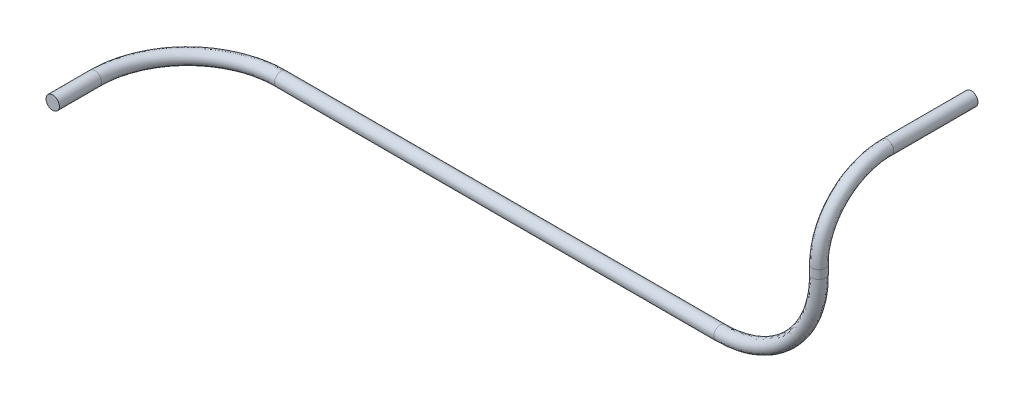
ISO-10303-21;
HEADER;
FILE_DESCRIPTION(('STEP AP214'),'2;1');
FILE_NAME('part.step','',(''),(''),'','','');
FILE_SCHEMA(('AUTOMOTIVE_DESIGN { 1 0 10303 214 1 1 1 1 }'));
ENDSEC;
DATA;
#1=APPLICATION_CONTEXT('core data for automotive mechanical design processes');
#2=APPLICATION_PROTOCOL_DEFINITION('international standard','automotive_design',2000,#1);
#3=PRODUCT_CONTEXT('',#1,'mechanical');
#4=PRODUCT('Part','Part','',(#3));
#5=PRODUCT_RELATED_PRODUCT_CATEGORY('part','',(#4));
#6=PRODUCT_DEFINITION_FORMATION('','',#4);
#7=PRODUCT_DEFINITION_CONTEXT('part definition',#1,'design');
#8=PRODUCT_DEFINITION('design','',#6,#7);
#9=PRODUCT_DEFINITION_SHAPE('','',#8);
#10=(LENGTH_UNIT() NAMED_UNIT(*) SI_UNIT(.MILLI.,.METRE.));
#11=(NAMED_UNIT(*) PLANE_ANGLE_UNIT() SI_UNIT($,.RADIAN.));
#12=(NAMED_UNIT(*) SI_UNIT($,.STERADIAN.) SOLID_ANGLE_UNIT());
#13=UNCERTAINTY_MEASURE_WITH_UNIT(LENGTH_MEASURE(1.E-05),#10,'distance_accuracy_value','');
#14=(GEOMETRIC_REPRESENTATION_CONTEXT(3) GLOBAL_UNCERTAINTY_ASSIGNED_CONTEXT((#13)) GLOBAL_UNIT_ASSIGNED_CONTEXT((#10,
#11,#12)) REPRESENTATION_CONTEXT('',''));
#15=CARTESIAN_POINT('',(0.,0.,0.));
#16=DIRECTION('',(0.,0.,1.));
#17=DIRECTION('',(1.,0.,0.));
#18=AXIS2_PLACEMENT_3D('',#15,#16,#17);
#19=CARTESIAN_POINT('',(0.,0.,-5.));
#20=DIRECTION('',(0.,0.,1.));
#21=DIRECTION('',(1.,0.,0.));
#22=AXIS2_PLACEMENT_3D('',#19,#20,#21);
#23=CYLINDRICAL_SURFACE('',#22,0.79375);
#24=CARTESIAN_POINT('',(0.,0.,-5.));
#25=DIRECTION('',(0.,0.,1.));
#26=DIRECTION('',(1.,0.,0.));
#27=AXIS2_PLACEMENT_3D('',#24,#25,#26);
#28=CIRCLE('',#27,0.79375);
#29=CARTESIAN_POINT('',(0.79375,0.,-5.));
#30=VERTEX_POINT('',#29);
#31=EDGE_CURVE('E56',#30,#30,#28,.T.);
#32=ORIENTED_EDGE('',*,*,#31,.T.);
#33=EDGE_LOOP('',(#32));
#34=FACE_BOUND('',#33,.T.);
#35=CARTESIAN_POINT('',(0.,0.,0.));
#36=DIRECTION('',(0.,0.,1.));
#37=DIRECTION('',(1.,0.,0.));
#38=AXIS2_PLACEMENT_3D('',#35,#36,#37);
#39=CIRCLE('',#38,0.79375);
#40=CARTESIAN_POINT('',(0.79375,0.,0.));
#41=VERTEX_POINT('',#40);
#42=EDGE_CURVE('E11',#41,#41,#39,.T.);
#43=ORIENTED_EDGE('',*,*,#42,.F.);
#44=EDGE_LOOP('',(#43));
#45=FACE_BOUND('',#44,.T.);
#46=ADVANCED_FACE('F50',(#34,#45),#23,.T.);
#47=CARTESIAN_POINT('',(0.,0.,0.));
#48=DIRECTION('',(0.,0.,1.));
#49=DIRECTION('',(1.,0.,0.));
#50=AXIS2_PLACEMENT_3D('',#47,#48,#49);
#51=PLANE('',#50);
#52=ORIENTED_EDGE('',*,*,#42,.T.);
#53=EDGE_LOOP('',(#52));
#54=FACE_BOUND('',#53,.T.);
#55=ADVANCED_FACE('F113',(#54),#51,.T.);
#56=CARTESIAN_POINT('',(0.79375,0.,-5.));
#57=CARTESIAN_POINT('',(0.79375,0.,-5.75791470527031));
#58=CARTESIAN_POINT('',(0.947458703845976,0.,-7.13341404587729));
#59=CARTESIAN_POINT('',(1.64573226308043,0.,-9.30386097522384));
#60=CARTESIAN_POINT('',(2.86086974263133,0.,-11.3021248697459));
#61=CARTESIAN_POINT('',(4.40097791212939,0.,-12.883008969989));
#62=CARTESIAN_POINT('',(6.09131269940605,0.,-14.0068828535127));
#63=CARTESIAN_POINT('',(7.73808429550463,0.,-14.7282448535644));
#64=CARTESIAN_POINT('',(9.4573145104304,0.,-15.1308606033688));
#65=CARTESIAN_POINT('',(10.5232896295579,0.,-15.2120002143836));
#66=CARTESIAN_POINT('',(11.1146249038585,0.,-15.2056072138141));
#67=CARTESIAN_POINT('',(0.79375,1.5875,-5.));
#68=CARTESIAN_POINT('',(0.79375,1.5875,-5.92119659554345));
#69=CARTESIAN_POINT('',(0.947493430227688,1.5875,-7.05267961373736));
#70=CARTESIAN_POINT('',(1.64559992899014,1.5875,-9.32712426579377));
#71=CARTESIAN_POINT('',(2.86138680719879,1.5875,-11.2956205566264));
#72=CARTESIAN_POINT('',(4.39920288431062,1.5875,-12.884358870039));
#73=CARTESIAN_POINT('',(6.09628471258547,1.5875,-14.0065188972045));
#74=CARTESIAN_POINT('',(7.72020785085567,1.5875,-14.7285171980952));
#75=CARTESIAN_POINT('',(9.51977905498164,1.5875,-15.1301643048536));
#76=CARTESIAN_POINT('',(10.3956160064048,1.5875,-15.2133805100991));
#77=CARTESIAN_POINT('',(11.1146249038585,1.5875,-15.2056072138141));
#78=CARTESIAN_POINT('',(-0.79375,1.5875,-5.));
#79=CARTESIAN_POINT('',(-0.79375,1.5875,-5.92119659554345));
#80=CARTESIAN_POINT('',(-0.617563445176048,1.5875,-7.43917767678465));
#81=CARTESIAN_POINT('',(0.192662422053791,1.5875,-9.98273856220126));
#82=CARTESIAN_POINT('',(1.58822494844731,1.5875,-12.2726247001221));
#83=CARTESIAN_POINT('',(3.37630421617554,1.5875,-14.1112254547258));
#84=CARTESIAN_POINT('',(5.31894537329175,1.5875,-15.4022926800262));
#85=CARTESIAN_POINT('',(7.22246689286393,1.5875,-16.2405351042305));
#86=CARTESIAN_POINT('',(9.2253833010839,1.5875,-16.7047754318933));
#87=CARTESIAN_POINT('',(10.4041970874858,1.5875,-16.8008805100991));
#88=CARTESIAN_POINT('',(11.1232059849395,1.5875,-16.7931072138141));
#89=CARTESIAN_POINT('',(-0.79375,0.,-5.));
#90=CARTESIAN_POINT('',(-0.79375,0.,-5.83955565040688));
#91=CARTESIAN_POINT('',(-0.617580808366904,0.,-7.47954489285461));
#92=CARTESIAN_POINT('',(0.192728589098937,0.,-9.9711069169163));
#93=CARTESIAN_POINT('',(1.58796641616358,0.,-12.2758768566818));
#94=CARTESIAN_POINT('',(3.37719173008492,0.,-14.1105505047008));
#95=CARTESIAN_POINT('',(5.31645936670205,0.,-15.4024746581804));
#96=CARTESIAN_POINT('',(7.23140511518841,0.,-16.2403989319651));
#97=CARTESIAN_POINT('',(9.19415102880827,0.,-16.7051235811509));
#98=CARTESIAN_POINT('',(10.4680338990624,0.,-16.8001903622413));
#99=CARTESIAN_POINT('',(11.1232059849395,0.,-16.7931072138141));
#100=CARTESIAN_POINT('',(-0.793750000000001,-1.5875,-5.));
#101=CARTESIAN_POINT('',(-0.793750000000001,-1.5875,-5.75791470527031));
#102=CARTESIAN_POINT('',(-0.617598171557761,-1.5875,-7.51991210892457));
#103=CARTESIAN_POINT('',(0.192794756144085,-1.5875,-9.95947527163133));
#104=CARTESIAN_POINT('',(1.58770788387985,-1.5875,-12.2791290132415));
#105=CARTESIAN_POINT('',(3.37807924399431,-1.5875,-14.1098755546758));
#106=CARTESIAN_POINT('',(5.31397336011234,-1.5875,-15.4026566363345));
#107=CARTESIAN_POINT('',(7.24034333751289,-1.5875,-16.2402627596997));
#108=CARTESIAN_POINT('',(9.16291875653265,-1.5875,-16.7054717304085));
#109=CARTESIAN_POINT('',(10.5318707106389,-1.5875,-16.7995002143836));
#110=CARTESIAN_POINT('',(11.1232059849395,-1.5875,-16.7931072138141));
#111=CARTESIAN_POINT('',(0.79375,-1.5875,-5.));
#112=CARTESIAN_POINT('',(0.79375,-1.5875,-5.59463281499717));
#113=CARTESIAN_POINT('',(0.947423977464262,-1.5875,-7.21414847801721));
#114=CARTESIAN_POINT('',(1.64586459717072,-1.5875,-9.28059768465391));
#115=CARTESIAN_POINT('',(2.86035267806387,-1.5875,-11.3086291828654));
#116=CARTESIAN_POINT('',(4.40275293994816,-1.5875,-12.8816590699391));
#117=CARTESIAN_POINT('',(6.08634068622664,-1.5875,-14.007246809821));
#118=CARTESIAN_POINT('',(7.75596074015359,-1.5875,-14.7279725090335));
#119=CARTESIAN_POINT('',(9.39484996587915,-1.5875,-15.131556901884));
#120=CARTESIAN_POINT('',(10.650963252711,-1.5875,-15.2106199186681));
#121=CARTESIAN_POINT('',(11.1146249038585,-1.5875,-15.2056072138141));
#122=CARTESIAN_POINT('',(0.79375,0.,-5.));
#123=CARTESIAN_POINT('',(0.79375,0.,-5.75791470527031));
#124=CARTESIAN_POINT('',(0.947458703845976,0.,-7.13341404587729));
#125=CARTESIAN_POINT('',(1.64573226308043,0.,-9.30386097522384));
#126=CARTESIAN_POINT('',(2.86086974263133,0.,-11.3021248697459));
#127=CARTESIAN_POINT('',(4.40097791212939,0.,-12.883008969989));
#128=CARTESIAN_POINT('',(6.09131269940605,0.,-14.0068828535127));
#129=CARTESIAN_POINT('',(7.73808429550463,0.,-14.7282448535644));
#130=CARTESIAN_POINT('',(9.4573145104304,0.,-15.1308606033688));
#131=CARTESIAN_POINT('',(10.5232896295579,0.,-15.2120002143836));
#132=CARTESIAN_POINT('',(11.1146249038585,0.,-15.2056072138141));
#133=(BOUNDED_SURFACE() B_SPLINE_SURFACE(3,3,((#56,#57,#58,#59,#60,#61,#62,#63,#64,#65,#66),
(#67,#68,#69,#70,#71,#72,#73,#74,#75,#76,#77),(#78,#79,#80,#81,#82,#83,#84,#85,#86,#87,#88),
(#89,#90,#91,#92,#93,#94,#95,#96,#97,#98,#99),(#100,#101,#102,#103,#104,#105,#106,#107,#108,
#109,#110),(#111,#112,#113,#114,#115,#116,#117,#118,#119,#120,#121),(#122,#123,#124,#125,#126,
#127,#128,#129,#130,#131,#132)),.UNSPECIFIED.,.T.,.F.,.F.) B_SPLINE_SURFACE_WITH_KNOTS((4,3,4),
(4,1,1,1,1,1,1,1,4),(0.,0.5,1.),(0.,0.130931082970301,0.270279637096541,0.415604669897305,
0.563037989856997,0.678066946086548,0.79020402207929,0.897842151731441,1.),
.UNSPECIFIED.) GEOMETRIC_REPRESENTATION_ITEM() RATIONAL_B_SPLINE_SURFACE(((1.,1.,1.,1.,1.,1.,1.,
1.,1.,1.,1.),(0.333333333333333,0.333333333333333,0.333333333333333,0.333333333333334,
0.333333333333333,0.333333333333333,0.333333333333333,0.333333333333333,0.333333333333333,
0.333333333333333,0.333333333333333),(0.333333333333333,0.333333333333333,0.333333333333333,
0.333333333333334,0.333333333333333,0.333333333333333,0.333333333333333,0.333333333333333,
0.333333333333333,0.333333333333333,0.333333333333333),(1.,1.,1.,1.,1.,1.,1.,1.,1.,1.,1.),
(0.333333333333333,0.333333333333333,0.333333333333333,0.333333333333334,0.333333333333333,
0.333333333333333,0.333333333333333,0.333333333333333,0.333333333333333,0.333333333333333,
0.333333333333333),(0.333333333333333,0.333333333333333,0.333333333333333,0.333333333333334,
0.333333333333333,0.333333333333333,0.333333333333333,0.333333333333333,0.333333333333333,
0.333333333333333,0.333333333333333),(1.,1.,1.,1.,1.,1.,1.,1.,1.,1.,1.))) REPRESENTATION_ITEM('') SURFACE());
#134=CARTESIAN_POINT('',(11.1146249038585,0.,-15.2056072138141));
#135=CARTESIAN_POINT('',(11.1146249038585,1.5875,-15.2056072138141));
#136=CARTESIAN_POINT('',(11.1232059849395,1.5875,-16.7931072138141));
#137=CARTESIAN_POINT('',(11.1232059849395,0.,-16.7931072138141));
#138=CARTESIAN_POINT('',(11.1232059849395,-1.5875,-16.7931072138141));
#139=CARTESIAN_POINT('',(11.1146249038585,-1.5875,-15.2056072138141));
#140=CARTESIAN_POINT('',(11.1146249038585,0.,-15.2056072138141));
#141=(BOUNDED_CURVE() B_SPLINE_CURVE(3,(#134,#135,#136,#137,#138,#139,#140),.UNSPECIFIED.,.T.,
.F.) B_SPLINE_CURVE_WITH_KNOTS((4,3,4),(0.,0.5,1.),
.UNSPECIFIED.) CURVE() GEOMETRIC_REPRESENTATION_ITEM() RATIONAL_B_SPLINE_CURVE((1.,
0.333333333333333,0.333333333333333,1.,0.333333333333333,0.333333333333333,1.)) REPRESENTATION_ITEM(''));
#142=CARTESIAN_POINT('',(11.1146249038585,0.,-15.2056072138141));
#143=VERTEX_POINT('',#142);
#144=EDGE_CURVE('E60',#143,#143,#141,.F.);
#145=ORIENTED_EDGE('',*,*,#31,.F.);
#146=EDGE_LOOP('',(#145));
#147=FACE_BOUND('',#146,.T.);
#148=ORIENTED_EDGE('',*,*,#144,.F.);
#149=EDGE_LOOP('',(#148));
#150=FACE_BOUND('',#149,.T.);
#151=ADVANCED_FACE('F117',(#147,#150),#133,.F.);
#152=CARTESIAN_POINT('',(11.1146249038585,0.,-15.2056072138141));
#153=CARTESIAN_POINT('',(63.238915444399,0.,-15.2056072138141));
#154=CARTESIAN_POINT('',(11.1146249038585,-1.5875,-15.2056072138141));
#155=CARTESIAN_POINT('',(63.238915444399,-1.5875,-15.2056072138141));
#156=CARTESIAN_POINT('',(11.1232059849395,-1.5875,-16.7931072138141));
#157=CARTESIAN_POINT('',(63.238915444399,-1.5875,-16.7931072138141));
#158=CARTESIAN_POINT('',(11.1232059849395,0.,-16.7931072138141));
#159=CARTESIAN_POINT('',(63.238915444399,0.,-16.7931072138141));
#160=CARTESIAN_POINT('',(11.1232059849395,1.5875,-16.7931072138141));
#161=CARTESIAN_POINT('',(63.238915444399,1.5875,-16.7931072138141));
#162=CARTESIAN_POINT('',(11.1146249038585,1.5875,-15.2056072138141));
#163=CARTESIAN_POINT('',(63.238915444399,1.5875,-15.2056072138141));
#164=CARTESIAN_POINT('',(11.1146249038585,0.,-15.2056072138141));
#165=CARTESIAN_POINT('',(63.238915444399,0.,-15.2056072138141));
#166=(BOUNDED_SURFACE() B_SPLINE_SURFACE(3,1,((#152,#153),(#154,#155),(#156,#157),(#158,#159),
(#160,#161),(#162,#163),(#164,#165)),.UNSPECIFIED.,.T.,.F.,.F.) B_SPLINE_SURFACE_WITH_KNOTS((4,
3,4),(2,2),(0.,0.5,1.),(0.,1.),
.UNSPECIFIED.) GEOMETRIC_REPRESENTATION_ITEM() RATIONAL_B_SPLINE_SURFACE(((1.,1.),
(0.333333333333333,0.333333333333333),(0.333333333333333,0.333333333333333),(1.,1.),
(0.333333333333333,0.333333333333333),(0.333333333333333,0.333333333333333),(1.,1.))) REPRESENTATION_ITEM('') SURFACE());
#167=CARTESIAN_POINT('',(63.238915444399,0.,-15.9993572138141));
#168=DIRECTION('',(-1.,0.,0.));
#169=DIRECTION('',(0.,0.,1.));
#170=AXIS2_PLACEMENT_3D('',#167,#168,#169);
#171=CIRCLE('',#170,0.793749999999999);
#172=CARTESIAN_POINT('',(63.238915444399,0.,-15.2056072138141));
#173=VERTEX_POINT('',#172);
#174=EDGE_CURVE('E64',#173,#173,#171,.T.);
#175=ORIENTED_EDGE('',*,*,#144,.T.);
#176=EDGE_LOOP('',(#175));
#177=FACE_BOUND('',#176,.T.);
#178=ORIENTED_EDGE('',*,*,#174,.T.);
#179=EDGE_LOOP('',(#178));
#180=FACE_BOUND('',#179,.T.);
#181=ADVANCED_FACE('F122',(#177,#180),#166,.T.);
#182=CARTESIAN_POINT('',(63.238915444399,0.,-15.2056072138141));
#183=CARTESIAN_POINT('',(63.8796086221979,0.,-15.2056072138141));
#184=CARTESIAN_POINT('',(65.1980816648985,0.111351397243252,-15.2056072138141));
#185=CARTESIAN_POINT('',(67.1655291867764,0.613309803811984,-15.2056072138141));
#186=CARTESIAN_POINT('',(69.0857340223771,1.49675366089993,-15.2056072138141));
#187=CARTESIAN_POINT('',(70.8594779099525,2.73978689095585,-15.2056072138141));
#188=CARTESIAN_POINT('',(72.3731498631737,4.29611111203534,-15.2056072138141));
#189=CARTESIAN_POINT('',(73.5560562787282,6.07718057769158,-15.2056072138141));
#190=CARTESIAN_POINT('',(74.3804999769711,7.97924835770397,-15.2056072138141));
#191=CARTESIAN_POINT('',(74.8371627018837,9.91786015976539,-15.2056072138141));
#192=CARTESIAN_POINT('',(74.9265101110586,11.2129813559598,-15.2056072138141));
#193=CARTESIAN_POINT('',(74.9177937493691,11.8418688904605,-15.2056072138141));
#194=CARTESIAN_POINT('',(63.238915444399,1.5875,-15.2056072138141));
#195=CARTESIAN_POINT('',(63.8796086221979,1.5875,-15.2056072138141));
#196=CARTESIAN_POINT('',(64.8892538999377,1.68377025536527,-15.205607213814));
#197=CARTESIAN_POINT('',(66.6492710522079,2.11936829078391,-15.2056072138141));
#198=CARTESIAN_POINT('',(68.2862323933272,2.88009894684861,-15.205607213814));
#199=CARTESIAN_POINT('',(69.8335291782678,3.96283900196412,-15.2056072138141));
#200=CARTESIAN_POINT('',(71.1308428795369,5.29831169231251,-15.205607213814));
#201=CARTESIAN_POINT('',(72.1599779235039,6.85350245831073,-15.2056072138141));
#202=CARTESIAN_POINT('',(72.8677987244304,8.47524946072614,-15.205607213814));
#203=CARTESIAN_POINT('',(73.262147042029,10.2101966405134,-15.205607213814));
#204=CARTESIAN_POINT('',(73.3390101110586,11.2019805339061,-15.2056072138141));
#205=CARTESIAN_POINT('',(73.3302937493691,11.8308680684068,-15.2056072138141));
#206=CARTESIAN_POINT('',(63.238915444399,1.5875,-16.7931072138141));
#207=CARTESIAN_POINT('',(63.8796086221979,1.5875,-16.7931072138141));
#208=CARTESIAN_POINT('',(64.8892538999377,1.68377025536529,-16.793107213814));
#209=CARTESIAN_POINT('',(66.6492710522079,2.11936829078383,-16.7931072138141));
#210=CARTESIAN_POINT('',(68.2862323933272,2.88009894684864,-16.793107213814));
#211=CARTESIAN_POINT('',(69.8335291782678,3.96283900196406,-16.7931072138141));
#212=CARTESIAN_POINT('',(71.1308428795368,5.29831169231256,-16.793107213814));
#213=CARTESIAN_POINT('',(72.1599779235039,6.85350245831072,-16.7931072138141));
#214=CARTESIAN_POINT('',(72.8677987244304,8.47524946072615,-16.793107213814));
#215=CARTESIAN_POINT('',(73.262147042029,10.2101966405134,-16.793107213814));
#216=CARTESIAN_POINT('',(73.3390101110586,11.2019805339061,-16.7931072138141));
#217=CARTESIAN_POINT('',(73.3302937493691,11.8308680684068,-16.7931072138141));
#218=CARTESIAN_POINT('',(63.238915444399,0.,-16.7931072138141));
#219=CARTESIAN_POINT('',(63.8796086221979,0.,-16.7931072138141));
#220=CARTESIAN_POINT('',(65.1980816648985,0.111351397243272,-16.7931072138141));
#221=CARTESIAN_POINT('',(67.1655291867764,0.613309803811908,-16.7931072138141));
#222=CARTESIAN_POINT('',(69.085734022377,1.49675366089996,-16.7931072138141));
#223=CARTESIAN_POINT('',(70.8594779099525,2.7397868909558,-16.7931072138141));
#224=CARTESIAN_POINT('',(72.3731498631736,4.29611111203539,-16.7931072138141));
#225=CARTESIAN_POINT('',(73.5560562787282,6.07718057769156,-16.7931072138141));
#226=CARTESIAN_POINT('',(74.380499976971,7.97924835770398,-16.7931072138141));
#227=CARTESIAN_POINT('',(74.8371627018837,9.91786015976539,-16.7931072138141));
#228=CARTESIAN_POINT('',(74.9265101110586,11.2129813559598,-16.7931072138141));
#229=CARTESIAN_POINT('',(74.9177937493691,11.8418688904605,-16.7931072138141));
#230=CARTESIAN_POINT('',(63.238915444399,-1.5875,-16.7931072138141));
#231=CARTESIAN_POINT('',(63.8796086221979,-1.5875,-16.7931072138141));
#232=CARTESIAN_POINT('',(65.5069094298592,-1.46106746087875,-16.7931072138141));
#233=CARTESIAN_POINT('',(67.681787321345,-0.892748683160016,-16.793107213814));
#234=CARTESIAN_POINT('',(69.8852356514269,0.113408374951254,-16.7931072138141));
#235=CARTESIAN_POINT('',(71.8854266416372,1.51673477994754,-16.793107213814));
#236=CARTESIAN_POINT('',(73.6154568468104,3.29391053175821,-16.7931072138141));
#237=CARTESIAN_POINT('',(74.9521346339525,5.30085869707242,-16.793107213814));
#238=CARTESIAN_POINT('',(75.8932012295117,7.4832472546818,-16.7931072138141));
#239=CARTESIAN_POINT('',(76.4121783617383,9.62552367901741,-16.7931072138141));
#240=CARTESIAN_POINT('',(76.5140101110586,11.2239821780134,-16.793107213814));
#241=CARTESIAN_POINT('',(76.5052937493691,11.8528697125141,-16.793107213814));
#242=CARTESIAN_POINT('',(63.238915444399,-1.5875,-15.2056072138141));
#243=CARTESIAN_POINT('',(63.8796086221979,-1.5875,-15.2056072138141));
#244=CARTESIAN_POINT('',(65.5069094298592,-1.46106746087877,-15.2056072138141));
#245=CARTESIAN_POINT('',(67.681787321345,-0.89274868315994,-15.205607213814));
#246=CARTESIAN_POINT('',(69.8852356514269,0.113408374951221,-15.2056072138141));
#247=CARTESIAN_POINT('',(71.8854266416372,1.5167347799476,-15.205607213814));
#248=CARTESIAN_POINT('',(73.6154568468104,3.29391053175817,-15.2056072138141));
#249=CARTESIAN_POINT('',(74.9521346339525,5.30085869707244,-15.205607213814));
#250=CARTESIAN_POINT('',(75.8932012295117,7.4832472546818,-15.2056072138141));
#251=CARTESIAN_POINT('',(76.4121783617383,9.6255236790174,-15.2056072138141));
#252=CARTESIAN_POINT('',(76.5140101110586,11.2239821780134,-15.205607213814));
#253=CARTESIAN_POINT('',(76.5052937493691,11.8528697125141,-15.205607213814));
#254=CARTESIAN_POINT('',(63.238915444399,0.,-15.2056072138141));
#255=CARTESIAN_POINT('',(63.8796086221979,0.,-15.2056072138141));
#256=CARTESIAN_POINT('',(65.1980816648985,0.111351397243252,-15.2056072138141));
#257=CARTESIAN_POINT('',(67.1655291867764,0.613309803811984,-15.2056072138141));
#258=CARTESIAN_POINT('',(69.0857340223771,1.49675366089993,-15.2056072138141));
#259=CARTESIAN_POINT('',(70.8594779099525,2.73978689095585,-15.2056072138141));
#260=CARTESIAN_POINT('',(72.3731498631737,4.29611111203534,-15.2056072138141));
#261=CARTESIAN_POINT('',(73.5560562787282,6.07718057769158,-15.2056072138141));
#262=CARTESIAN_POINT('',(74.3804999769711,7.97924835770397,-15.2056072138141));
#263=CARTESIAN_POINT('',(74.8371627018837,9.91786015976539,-15.2056072138141));
#264=CARTESIAN_POINT('',(74.9265101110586,11.2129813559598,-15.2056072138141));
#265=CARTESIAN_POINT('',(74.9177937493691,11.8418688904605,-15.2056072138141));
#266=(BOUNDED_SURFACE() B_SPLINE_SURFACE(3,3,((#182,#183,#184,#185,#186,#187,#188,#189,#190,
#191,#192,#193),(#194,#195,#196,#197,#198,#199,#200,#201,#202,#203,#204,#205),(#206,#207,#208,
#209,#210,#211,#212,#213,#214,#215,#216,#217),(#218,#219,#220,#221,#222,#223,#224,#225,#226,
#227,#228,#229),(#230,#231,#232,#233,#234,#235,#236,#237,#238,#239,#240,#241),(#242,#243,#244,
#245,#246,#247,#248,#249,#250,#251,#252,#253),(#254,#255,#256,#257,#258,#259,#260,#261,#262,
#263,#264,#265)),.UNSPECIFIED.,.T.,.F.,.F.) B_SPLINE_SURFACE_WITH_KNOTS((4,3,4),(4,1,1,1,1,1,1,
1,1,4),(0.,0.5,1.),(0.,0.103991613058036,0.213654435157194,0.327971910925508,0.445153940003127,
0.563248262233331,0.678229338185863,0.79033960893561,0.897914750968003,1.),
.UNSPECIFIED.) GEOMETRIC_REPRESENTATION_ITEM() RATIONAL_B_SPLINE_SURFACE(((1.,1.,1.,1.,1.,1.,1.,
1.,1.,1.,1.,1.),(0.333333333333333,0.333333333333333,0.333333333333333,0.333333333333333,
0.333333333333333,0.333333333333333,0.333333333333333,0.333333333333333,0.333333333333333,
0.333333333333333,0.333333333333333,0.333333333333333),(0.333333333333333,0.333333333333333,
0.333333333333333,0.333333333333333,0.333333333333333,0.333333333333333,0.333333333333333,
0.333333333333333,0.333333333333333,0.333333333333333,0.333333333333333,0.333333333333333),(1.,
1.,1.,1.,1.,1.,1.,1.,1.,1.,1.,1.),(0.333333333333333,0.333333333333333,0.333333333333333,
0.333333333333333,0.333333333333333,0.333333333333333,0.333333333333333,0.333333333333333,
0.333333333333333,0.333333333333333,0.333333333333333,0.333333333333333),(0.333333333333333,
0.333333333333333,0.333333333333333,0.333333333333333,0.333333333333333,0.333333333333333,
0.333333333333333,0.333333333333333,0.333333333333333,0.333333333333333,0.333333333333333,
0.333333333333333),(1.,1.,1.,1.,1.,1.,1.,1.,1.,1.,1.,1.))) REPRESENTATION_ITEM('') SURFACE());
#267=CARTESIAN_POINT('',(74.9177937493691,11.8418688904605,-15.2056072138141));
#268=CARTESIAN_POINT('',(73.3302937493691,11.8308680684068,-15.2056072138141));
#269=CARTESIAN_POINT('',(73.3302937493691,11.8308680684068,-16.7931072138141));
#270=CARTESIAN_POINT('',(74.9177937493691,11.8418688904605,-16.7931072138141));
#271=CARTESIAN_POINT('',(76.5052937493691,11.8528697125141,-16.793107213814));
#272=CARTESIAN_POINT('',(76.5052937493691,11.8528697125141,-15.205607213814));
#273=CARTESIAN_POINT('',(74.9177937493691,11.8418688904605,-15.2056072138141));
#274=(BOUNDED_CURVE() B_SPLINE_CURVE(3,(#267,#268,#269,#270,#271,#272,#273),.UNSPECIFIED.,.T.,
.F.) B_SPLINE_CURVE_WITH_KNOTS((4,3,4),(0.,0.5,1.),
.UNSPECIFIED.) CURVE() GEOMETRIC_REPRESENTATION_ITEM() RATIONAL_B_SPLINE_CURVE((1.,
0.333333333333333,0.333333333333333,1.,0.333333333333333,0.333333333333333,1.)) REPRESENTATION_ITEM(''));
#275=CARTESIAN_POINT('',(74.9177937493691,11.8418688904605,-15.2056072138141));
#276=VERTEX_POINT('',#275);
#277=EDGE_CURVE('E74',#276,#276,#274,.F.);
#278=ORIENTED_EDGE('',*,*,#174,.F.);
#279=EDGE_LOOP('',(#278));
#280=FACE_BOUND('',#279,.T.);
#281=ORIENTED_EDGE('',*,*,#277,.F.);
#282=EDGE_LOOP('',(#281));
#283=FACE_BOUND('',#282,.T.);
#284=ADVANCED_FACE('F137',(#280,#283),#266,.F.);
#285=CARTESIAN_POINT('',(74.9177937493691,11.8418688904605,-15.2056072138141));
#286=CARTESIAN_POINT('',(74.9177937493691,12.8418688904605,-15.2056072138141));
#287=CARTESIAN_POINT('',(76.5052937493691,11.8528697125141,-15.205607213814));
#288=CARTESIAN_POINT('',(76.5052937493691,12.8418688904605,-15.205607213814));
#289=CARTESIAN_POINT('',(76.5052937493691,11.8528697125141,-16.793107213814));
#290=CARTESIAN_POINT('',(76.5052937493691,12.8418688904605,-16.793107213814));
#291=CARTESIAN_POINT('',(74.9177937493691,11.8418688904605,-16.7931072138141));
#292=CARTESIAN_POINT('',(74.9177937493691,12.8418688904605,-16.7931072138141));
#293=CARTESIAN_POINT('',(73.3302937493691,11.8308680684068,-16.7931072138141));
#294=CARTESIAN_POINT('',(73.3302937493691,12.8418688904605,-16.7931072138141));
#295=CARTESIAN_POINT('',(73.330293749369,11.8308680684068,-15.2056072138141));
#296=CARTESIAN_POINT('',(73.330293749369,12.8418688904605,-15.2056072138141));
#297=CARTESIAN_POINT('',(74.9177937493691,11.8418688904605,-15.2056072138141));
#298=CARTESIAN_POINT('',(74.9177937493691,12.8418688904605,-15.2056072138141));
#299=(BOUNDED_SURFACE() B_SPLINE_SURFACE(3,1,((#285,#286),(#287,#288),(#289,#290),(#291,#292),
(#293,#294),(#295,#296),(#297,#298)),.UNSPECIFIED.,.T.,.F.,.F.) B_SPLINE_SURFACE_WITH_KNOTS((4,
3,4),(2,2),(0.,0.5,1.),(0.,1.),
.UNSPECIFIED.) GEOMETRIC_REPRESENTATION_ITEM() RATIONAL_B_SPLINE_SURFACE(((1.,1.),
(0.333333333333333,0.333333333333333),(0.333333333333333,0.333333333333333),(1.,1.),
(0.333333333333333,0.333333333333333),(0.333333333333333,0.333333333333333),(1.,1.))) REPRESENTATION_ITEM('') SURFACE());
#300=CARTESIAN_POINT('',(74.9177937493691,12.8418688904605,-15.9993572138141));
#301=DIRECTION('',(0.,-1.,0.));
#302=DIRECTION('',(0.,0.,-1.));
#303=AXIS2_PLACEMENT_3D('',#300,#301,#302);
#304=CIRCLE('',#303,0.793749999999999);
#305=CARTESIAN_POINT('',(74.9177937493691,12.8418688904605,-16.7931072138141));
#306=VERTEX_POINT('',#305);
#307=EDGE_CURVE('E79',#306,#306,#304,.T.);
#308=ORIENTED_EDGE('',*,*,#277,.T.);
#309=EDGE_LOOP('',(#308));
#310=FACE_BOUND('',#309,.T.);
#311=ORIENTED_EDGE('',*,*,#307,.T.);
#312=EDGE_LOOP('',(#311));
#313=FACE_BOUND('',#312,.T.);
#314=ADVANCED_FACE('F109',(#310,#313),#299,.T.);
#315=CARTESIAN_POINT('',(74.9177937493691,12.8418688904605,-16.7931072138141));
#316=CARTESIAN_POINT('',(74.9177937493691,13.3931826548107,-16.7931072138141));
#317=CARTESIAN_POINT('',(74.9177937493692,14.3410074603431,-16.9018639841204));
#318=CARTESIAN_POINT('',(74.9177937493693,15.8832620348302,-17.3946825822054));
#319=CARTESIAN_POINT('',(74.9177937493691,17.2927750713951,-18.2541568675835));
#320=CARTESIAN_POINT('',(74.9177937493692,18.4087080987125,-19.3407633442648));
#321=CARTESIAN_POINT('',(74.9177937493691,19.2028283380258,-20.5368998571705));
#322=CARTESIAN_POINT('',(74.9177937493692,19.711485838851,-21.6969948760446));
#323=CARTESIAN_POINT('',(74.9177937493691,19.9954126058251,-22.9198799218234));
#324=CARTESIAN_POINT('',(74.9177937493692,20.0524197526595,-23.6540328268013));
#325=CARTESIAN_POINT('',(74.9177937493692,20.0476211104158,-24.0841723600083));
#326=CARTESIAN_POINT('',(76.5052937493691,12.8418688904605,-16.7931072138141));
#327=CARTESIAN_POINT('',(76.5052937493691,13.5564780811338,-16.7931072138141));
#328=CARTESIAN_POINT('',(76.5052937493692,14.2602675320226,-16.901898712643));
#329=CARTESIAN_POINT('',(76.5052937493693,15.9065293900383,-17.3945502359251));
#330=CARTESIAN_POINT('',(76.5052937493691,17.286269857742,-18.2546740154382));
#331=CARTESIAN_POINT('',(76.5052937493691,18.4100588813902,-19.3389881375477));
#332=CARTESIAN_POINT('',(76.5052937493692,19.2024626194981,-20.5418727590736));
#333=CARTESIAN_POINT('',(76.5052937493691,19.711764371079,-21.6791173161954));
#334=CARTESIAN_POINT('',(76.5052937493692,19.9946946923601,-22.9823507232902));
#335=CARTESIAN_POINT('',(76.5052937493691,20.0538441490803,-23.5263531248403));
#336=CARTESIAN_POINT('',(76.5052937493691,20.0476211104159,-24.0841723600083));
#337=CARTESIAN_POINT('',(76.5052937493691,12.8418688904605,-15.2056072138141));
#338=CARTESIAN_POINT('',(76.5052937493691,13.5564780811338,-15.2056072138141));
#339=CARTESIAN_POINT('',(76.505293749369,14.6467882439404,-15.336841669902));
#340=CARTESIAN_POINT('',(76.5052937493689,16.5622301492152,-15.9416515557906));
#341=CARTESIAN_POINT('',(76.505293749369,18.2633481269377,-16.9815611091414));
#342=CARTESIAN_POINT('',(76.505293749369,19.6370612417337,-18.3162483244073));
#343=CARTESIAN_POINT('',(76.505293749369,20.5983270419565,-19.7646915189184));
#344=CARTESIAN_POINT('',(76.505293749369,21.2238649030678,-21.1816176607856));
#345=CARTESIAN_POINT('',(76.505293749369,21.5693542049302,-22.6882002069621));
#346=CARTESIAN_POINT('',(76.505293749369,21.6413441490803,-23.5352079346935));
#347=CARTESIAN_POINT('',(76.505293749369,21.6351211104159,-24.0930271698615));
#348=CARTESIAN_POINT('',(74.9177937493691,12.8418688904605,-15.2056072138141));
#349=CARTESIAN_POINT('',(74.9177937493691,13.4748303679722,-15.2056072138141));
#350=CARTESIAN_POINT('',(74.917793749369,14.6871582081006,-15.3368243056407));
#351=CARTESIAN_POINT('',(74.9177937493689,16.5505964716111,-15.9417177289309));
#352=CARTESIAN_POINT('',(74.917793749369,18.2666007337642,-16.981302535214));
#353=CARTESIAN_POINT('',(74.917793749369,19.6363858503948,-18.3171359277658));
#354=CARTESIAN_POINT('',(74.917793749369,20.5985099012203,-19.7622050679668));
#355=CARTESIAN_POINT('',(74.917793749369,21.2237256369537,-21.1905564407102));
#356=CARTESIAN_POINT('',(74.917793749369,21.5697131616626,-22.6569648062287));
#357=CARTESIAN_POINT('',(74.917793749369,21.6406319508698,-23.599047785674));
#358=CARTESIAN_POINT('',(74.917793749369,21.6351211104158,-24.0930271698615));
#359=CARTESIAN_POINT('',(73.3302937493691,12.8418688904605,-15.2056072138141));
#360=CARTESIAN_POINT('',(73.3302937493691,13.3931826548107,-15.2056072138141));
#361=CARTESIAN_POINT('',(73.3302937493691,14.7275281722609,-15.3368069413795));
#362=CARTESIAN_POINT('',(73.3302937493689,16.5389627940069,-15.9417839020712));
#363=CARTESIAN_POINT('',(73.330293749369,18.2698533405907,-16.9810439612866));
#364=CARTESIAN_POINT('',(73.330293749369,19.6357104590559,-18.3180235311244));
#365=CARTESIAN_POINT('',(73.330293749369,20.5986927604841,-19.7597186170152));
#366=CARTESIAN_POINT('',(73.330293749369,21.2235863708396,-21.1994952206348));
#367=CARTESIAN_POINT('',(73.330293749369,21.570072118395,-22.6257294054954));
#368=CARTESIAN_POINT('',(73.330293749369,21.6399197526593,-23.6628876366545));
#369=CARTESIAN_POINT('',(73.330293749369,21.6351211104156,-24.0930271698615));
#370=CARTESIAN_POINT('',(73.3302937493691,12.8418688904605,-16.7931072138141));
#371=CARTESIAN_POINT('',(73.3302937493691,13.2298872284877,-16.7931072138141));
#372=CARTESIAN_POINT('',(73.3302937493692,14.4217473886637,-16.9018292555977));
#373=CARTESIAN_POINT('',(73.3302937493693,15.8599946796221,-17.3948149284857));
#374=CARTESIAN_POINT('',(73.3302937493691,17.2992802850481,-18.2536397197287));
#375=CARTESIAN_POINT('',(73.3302937493691,18.4073573160349,-19.3425385509818));
#376=CARTESIAN_POINT('',(73.3302937493692,19.2031940565535,-20.5319269552673));
#377=CARTESIAN_POINT('',(73.3302937493691,19.7112073066229,-21.7148724358938));
#378=CARTESIAN_POINT('',(73.3302937493692,19.9961305192901,-22.8574091203566));
#379=CARTESIAN_POINT('',(73.3302937493692,20.0509953562387,-23.7817125287623));
#380=CARTESIAN_POINT('',(73.3302937493692,20.0476211104156,-24.0841723600083));
#381=CARTESIAN_POINT('',(74.9177937493691,12.8418688904605,-16.7931072138141));
#382=CARTESIAN_POINT('',(74.9177937493691,13.3931826548107,-16.7931072138141));
#383=CARTESIAN_POINT('',(74.9177937493692,14.3410074603431,-16.9018639841204));
#384=CARTESIAN_POINT('',(74.9177937493693,15.8832620348302,-17.3946825822054));
#385=CARTESIAN_POINT('',(74.9177937493691,17.2927750713951,-18.2541568675835));
#386=CARTESIAN_POINT('',(74.9177937493692,18.4087080987125,-19.3407633442648));
#387=CARTESIAN_POINT('',(74.9177937493691,19.2028283380258,-20.5368998571705));
#388=CARTESIAN_POINT('',(74.9177937493692,19.711485838851,-21.6969948760446));
#389=CARTESIAN_POINT('',(74.9177937493691,19.9954126058251,-22.9198799218234));
#390=CARTESIAN_POINT('',(74.9177937493692,20.0524197526595,-23.6540328268013));
#391=CARTESIAN_POINT('',(74.9177937493692,20.0476211104158,-24.0841723600083));
#392=(BOUNDED_SURFACE() B_SPLINE_SURFACE(3,3,((#315,#316,#317,#318,#319,#320,#321,#322,#323,
#324,#325),(#326,#327,#328,#329,#330,#331,#332,#333,#334,#335,#336),(#337,#338,#339,#340,#341,
#342,#343,#344,#345,#346,#347),(#348,#349,#350,#351,#352,#353,#354,#355,#356,#357,#358),(#359,
#360,#361,#362,#363,#364,#365,#366,#367,#368,#369),(#370,#371,#372,#373,#374,#375,#376,#377,
#378,#379,#380),(#381,#382,#383,#384,#385,#386,#387,#388,#389,#390,#391)),.UNSPECIFIED.,.T.,.F.,
.F.) B_SPLINE_SURFACE_WITH_KNOTS((4,3,4),(4,1,1,1,1,1,1,1,4),(0.,0.5,1.),(0.,0.130927892166234,
0.270271495761659,0.415605331809059,0.563034504876979,0.678073087371199,0.790206208465522,
0.897845782888229,1.),
.UNSPECIFIED.) GEOMETRIC_REPRESENTATION_ITEM() RATIONAL_B_SPLINE_SURFACE(((1.,1.,1.,1.,1.,1.,1.,
1.,1.,1.,1.),(0.333333333333333,0.333333333333333,0.333333333333333,0.333333333333333,
0.333333333333333,0.333333333333333,0.333333333333333,0.333333333333333,0.333333333333333,
0.333333333333333,0.333333333333333),(0.333333333333333,0.333333333333333,0.333333333333333,
0.333333333333333,0.333333333333333,0.333333333333333,0.333333333333333,0.333333333333333,
0.333333333333333,0.333333333333333,0.333333333333333),(1.,1.,1.,1.,1.,1.,1.,1.,1.,1.,1.),
(0.333333333333333,0.333333333333333,0.333333333333333,0.333333333333333,0.333333333333333,
0.333333333333333,0.333333333333333,0.333333333333333,0.333333333333333,0.333333333333333,
0.333333333333333),(0.333333333333333,0.333333333333333,0.333333333333333,0.333333333333333,
0.333333333333333,0.333333333333333,0.333333333333333,0.333333333333333,0.333333333333333,
0.333333333333333,0.333333333333333),(1.,1.,1.,1.,1.,1.,1.,1.,1.,1.,1.))) REPRESENTATION_ITEM('') SURFACE());
#393=CARTESIAN_POINT('',(74.9177937493692,20.0476211104158,-24.0841723600083));
#394=CARTESIAN_POINT('',(76.5052937493691,20.0476211104159,-24.0841723600083));
#395=CARTESIAN_POINT('',(76.505293749369,21.6351211104159,-24.0930271698615));
#396=CARTESIAN_POINT('',(74.917793749369,21.6351211104158,-24.0930271698615));
#397=CARTESIAN_POINT('',(73.330293749369,21.6351211104156,-24.0930271698615));
#398=CARTESIAN_POINT('',(73.3302937493692,20.0476211104156,-24.0841723600083));
#399=CARTESIAN_POINT('',(74.9177937493692,20.0476211104158,-24.0841723600083));
#400=(BOUNDED_CURVE() B_SPLINE_CURVE(3,(#393,#394,#395,#396,#397,#398,#399),.UNSPECIFIED.,.T.,
.F.) B_SPLINE_CURVE_WITH_KNOTS((4,3,4),(0.,0.5,1.),
.UNSPECIFIED.) CURVE() GEOMETRIC_REPRESENTATION_ITEM() RATIONAL_B_SPLINE_CURVE((1.,
0.333333333333333,0.333333333333333,1.,0.333333333333333,0.333333333333333,1.)) REPRESENTATION_ITEM(''));
#401=CARTESIAN_POINT('',(74.9177937493692,20.0476211104158,-24.0841723600083));
#402=VERTEX_POINT('',#401);
#403=EDGE_CURVE('E85',#402,#402,#400,.F.);
#404=ORIENTED_EDGE('',*,*,#307,.F.);
#405=EDGE_LOOP('',(#404));
#406=FACE_BOUND('',#405,.T.);
#407=ORIENTED_EDGE('',*,*,#403,.F.);
#408=EDGE_LOOP('',(#407));
#409=FACE_BOUND('',#408,.T.);
#410=ADVANCED_FACE('F101',(#406,#409),#392,.F.);
#411=CARTESIAN_POINT('',(74.917793749369,21.6351211104158,-34.0885997649349));
#412=DIRECTION('',(0.,0.,1.));
#413=DIRECTION('',(1.,0.,0.));
#414=AXIS2_PLACEMENT_3D('',#411,#412,#413);
#415=PLANE('',#414);
#416=CARTESIAN_POINT('',(74.9177937493691,20.8413711104158,-34.0885997649349));
#417=DIRECTION('',(0.,0.,1.));
#418=DIRECTION('',(1.,0.,0.));
#419=AXIS2_PLACEMENT_3D('',#416,#417,#418);
#420=CIRCLE('',#419,0.793749999999999);
#421=CARTESIAN_POINT('',(75.7115437493691,20.8413711104158,-34.0885997649349));
#422=VERTEX_POINT('',#421);
#423=EDGE_CURVE('E90',#422,#422,#420,.T.);
#424=ORIENTED_EDGE('',*,*,#423,.F.);
#425=EDGE_LOOP('',(#424));
#426=FACE_BOUND('',#425,.T.);
#427=ADVANCED_FACE('F99',(#426),#415,.F.);
#428=CARTESIAN_POINT('',(74.9177937493692,20.0476211104158,-24.0841723600083));
#429=CARTESIAN_POINT('',(74.9177937493692,20.0476211104158,-34.0885997649349));
#430=CARTESIAN_POINT('',(73.3302937493692,20.0476211104156,-24.0841723600083));
#431=CARTESIAN_POINT('',(73.3302937493692,20.0476211104156,-34.0885997649349));
#432=CARTESIAN_POINT('',(73.330293749369,21.6351211104156,-24.0930271698615));
#433=CARTESIAN_POINT('',(73.330293749369,21.6351211104156,-34.0885997649349));
#434=CARTESIAN_POINT('',(74.917793749369,21.6351211104158,-24.0930271698615));
#435=CARTESIAN_POINT('',(74.917793749369,21.6351211104158,-34.0885997649349));
#436=CARTESIAN_POINT('',(76.505293749369,21.6351211104159,-24.0930271698615));
#437=CARTESIAN_POINT('',(76.505293749369,21.6351211104159,-34.0885997649349));
#438=CARTESIAN_POINT('',(76.5052937493691,20.0476211104159,-24.0841723600083));
#439=CARTESIAN_POINT('',(76.5052937493691,20.0476211104159,-34.0885997649349));
#440=CARTESIAN_POINT('',(74.9177937493692,20.0476211104158,-24.0841723600083));
#441=CARTESIAN_POINT('',(74.9177937493692,20.0476211104158,-34.0885997649349));
#442=(BOUNDED_SURFACE() B_SPLINE_SURFACE(3,1,((#428,#429),(#430,#431),(#432,#433),(#434,#435),
(#436,#437),(#438,#439),(#440,#441)),.UNSPECIFIED.,.T.,.F.,.F.) B_SPLINE_SURFACE_WITH_KNOTS((4,
3,4),(2,2),(0.,0.5,1.),(0.,1.),
.UNSPECIFIED.) GEOMETRIC_REPRESENTATION_ITEM() RATIONAL_B_SPLINE_SURFACE(((1.,1.),
(0.333333333333333,0.333333333333333),(0.333333333333333,0.333333333333333),(1.,1.),
(0.333333333333333,0.333333333333333),(0.333333333333333,0.333333333333333),(1.,1.))) REPRESENTATION_ITEM('') SURFACE());
#443=ORIENTED_EDGE('',*,*,#403,.T.);
#444=EDGE_LOOP('',(#443));
#445=FACE_BOUND('',#444,.T.);
#446=ORIENTED_EDGE('',*,*,#423,.T.);
#447=EDGE_LOOP('',(#446));
#448=FACE_BOUND('',#447,.T.);
#449=ADVANCED_FACE('F97',(#445,#448),#442,.T.);
#450=CLOSED_SHELL('',(#46,#55,#151,#181,#284,#314,#410,#427,#449));
#451=MANIFOLD_SOLID_BREP('B2',#450);
#452=ADVANCED_BREP_SHAPE_REPRESENTATION('',(#18,#451),#14);
#453=SHAPE_DEFINITION_REPRESENTATION(#9,#452);
ENDSEC;
END-ISO-10303-21;
